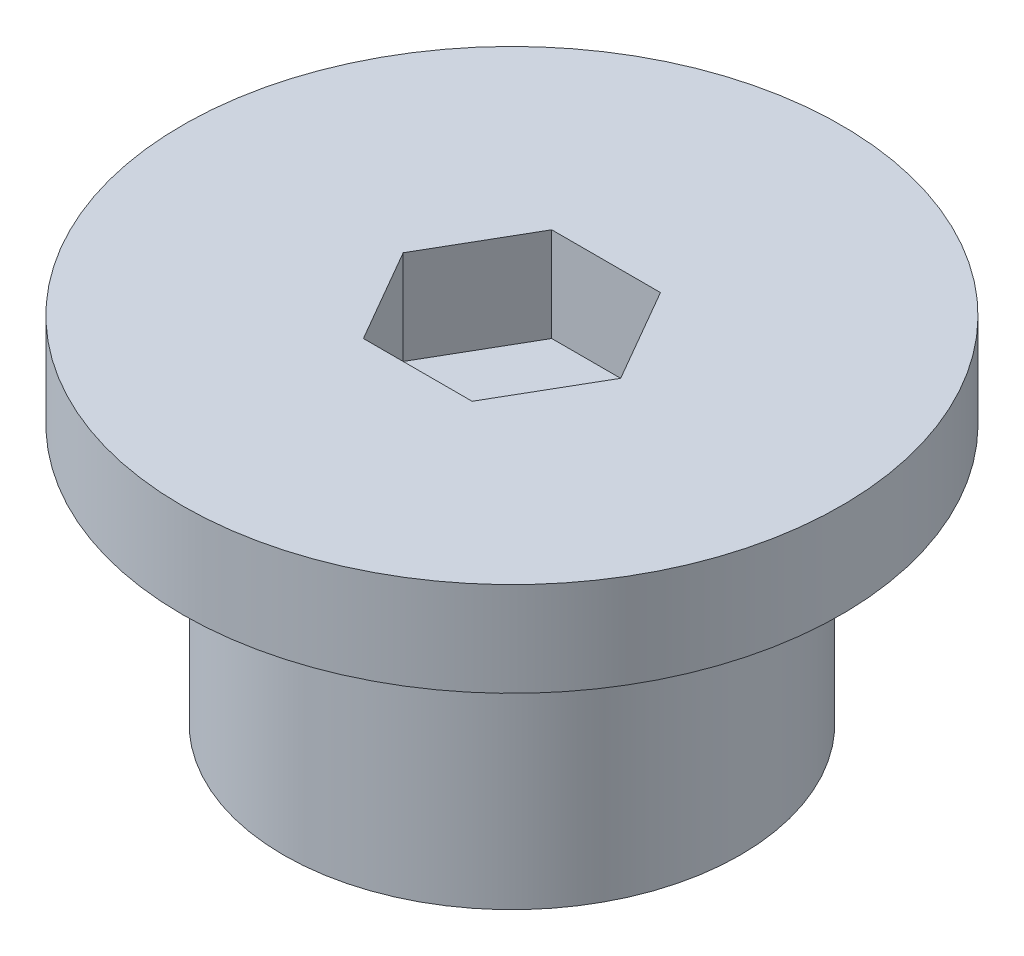
ISO-10303-21;
HEADER;
FILE_DESCRIPTION(('STEP AP214'),'2;1');
FILE_NAME('part.step','',(''),(''),'','','');
FILE_SCHEMA(('AUTOMOTIVE_DESIGN { 1 0 10303 214 1 1 1 1 }'));
ENDSEC;
DATA;
#1=APPLICATION_CONTEXT('core data for automotive mechanical design processes');
#2=APPLICATION_PROTOCOL_DEFINITION('international standard','automotive_design',2000,#1);
#3=PRODUCT_CONTEXT('',#1,'mechanical');
#4=PRODUCT('Part','Part','',(#3));
#5=PRODUCT_RELATED_PRODUCT_CATEGORY('part','',(#4));
#6=PRODUCT_DEFINITION_FORMATION('','',#4);
#7=PRODUCT_DEFINITION_CONTEXT('part definition',#1,'design');
#8=PRODUCT_DEFINITION('design','',#6,#7);
#9=PRODUCT_DEFINITION_SHAPE('','',#8);
#10=(LENGTH_UNIT() NAMED_UNIT(*) SI_UNIT(.MILLI.,.METRE.));
#11=(NAMED_UNIT(*) PLANE_ANGLE_UNIT() SI_UNIT($,.RADIAN.));
#12=(NAMED_UNIT(*) SI_UNIT($,.STERADIAN.) SOLID_ANGLE_UNIT());
#13=UNCERTAINTY_MEASURE_WITH_UNIT(LENGTH_MEASURE(1.E-05),#10,'distance_accuracy_value','');
#14=(GEOMETRIC_REPRESENTATION_CONTEXT(3) GLOBAL_UNCERTAINTY_ASSIGNED_CONTEXT((#13)) GLOBAL_UNIT_ASSIGNED_CONTEXT((#10,
#11,#12)) REPRESENTATION_CONTEXT('',''));
#15=CARTESIAN_POINT('',(0.,0.,0.));
#16=DIRECTION('',(0.,0.,1.));
#17=DIRECTION('',(1.,0.,0.));
#18=AXIS2_PLACEMENT_3D('',#15,#16,#17);
#19=CARTESIAN_POINT('',(0.,0.,0.));
#20=DIRECTION('',(0.,1.,0.));
#21=DIRECTION('',(0.,0.,1.));
#22=AXIS2_PLACEMENT_3D('',#19,#20,#21);
#23=PLANE('',#22);
#24=CARTESIAN_POINT('',(0.,0.,0.));
#25=DIRECTION('',(0.,1.,0.));
#26=DIRECTION('',(0.,0.,1.));
#27=AXIS2_PLACEMENT_3D('',#24,#25,#26);
#28=CIRCLE('',#27,4.85);
#29=CARTESIAN_POINT('',(0.,0.,4.85));
#30=VERTEX_POINT('',#29);
#31=EDGE_CURVE('E11',#30,#30,#28,.T.);
#32=ORIENTED_EDGE('',*,*,#31,.F.);
#33=EDGE_LOOP('',(#32));
#34=FACE_BOUND('',#33,.T.);
#35=ADVANCED_FACE('F38',(#34),#23,.F.);
#36=CARTESIAN_POINT('',(0.,21.439331354887,0.));
#37=DIRECTION('',(0.,1.,0.));
#38=DIRECTION('',(0.,0.,1.));
#39=AXIS2_PLACEMENT_3D('',#36,#37,#38);
#40=CYLINDRICAL_SURFACE('',#39,4.85);
#41=CARTESIAN_POINT('',(0.,5.5,0.));
#42=DIRECTION('',(0.,1.,0.));
#43=DIRECTION('',(0.,0.,1.));
#44=AXIS2_PLACEMENT_3D('',#41,#42,#43);
#45=CIRCLE('',#44,4.85);
#46=CARTESIAN_POINT('',(0.,5.5,4.85));
#47=VERTEX_POINT('',#46);
#48=EDGE_CURVE('E45',#47,#47,#45,.T.);
#49=ORIENTED_EDGE('',*,*,#48,.F.);
#50=EDGE_LOOP('',(#49));
#51=FACE_BOUND('',#50,.T.);
#52=ORIENTED_EDGE('',*,*,#31,.T.);
#53=EDGE_LOOP('',(#52));
#54=FACE_BOUND('',#53,.T.);
#55=ADVANCED_FACE('F154',(#51,#54),#40,.T.);
#56=CARTESIAN_POINT('',(4.85,5.5,0.));
#57=DIRECTION('',(0.,1.,0.));
#58=DIRECTION('',(0.,0.,1.));
#59=AXIS2_PLACEMENT_3D('',#56,#57,#58);
#60=PLANE('',#59);
#61=CARTESIAN_POINT('',(0.,5.5,0.));
#62=DIRECTION('',(0.,1.,0.));
#63=DIRECTION('',(0.,0.,1.));
#64=AXIS2_PLACEMENT_3D('',#61,#62,#63);
#65=CIRCLE('',#64,7.);
#66=CARTESIAN_POINT('',(0.,5.5,7.));
#67=VERTEX_POINT('',#66);
#68=EDGE_CURVE('E147',#67,#67,#65,.T.);
#69=ORIENTED_EDGE('',*,*,#68,.F.);
#70=EDGE_LOOP('',(#69));
#71=FACE_BOUND('',#70,.T.);
#72=ORIENTED_EDGE('',*,*,#48,.T.);
#73=EDGE_LOOP('',(#72));
#74=FACE_BOUND('',#73,.T.);
#75=ADVANCED_FACE('F152',(#71,#74),#60,.F.);
#76=CARTESIAN_POINT('',(0.,21.439331354887,0.));
#77=DIRECTION('',(0.,1.,0.));
#78=DIRECTION('',(0.,0.,1.));
#79=AXIS2_PLACEMENT_3D('',#76,#77,#78);
#80=CYLINDRICAL_SURFACE('',#79,7.);
#81=CARTESIAN_POINT('',(0.,7.5,0.));
#82=DIRECTION('',(0.,1.,0.));
#83=DIRECTION('',(0.,0.,1.));
#84=AXIS2_PLACEMENT_3D('',#81,#82,#83);
#85=CIRCLE('',#84,7.);
#86=CARTESIAN_POINT('',(0.,7.5,7.));
#87=VERTEX_POINT('',#86);
#88=EDGE_CURVE('E139',#87,#87,#85,.T.);
#89=ORIENTED_EDGE('',*,*,#88,.F.);
#90=EDGE_LOOP('',(#89));
#91=FACE_BOUND('',#90,.T.);
#92=ORIENTED_EDGE('',*,*,#68,.T.);
#93=EDGE_LOOP('',(#92));
#94=FACE_BOUND('',#93,.T.);
#95=ADVANCED_FACE('F173',(#91,#94),#80,.T.);
#96=CARTESIAN_POINT('',(0.,7.5,0.));
#97=DIRECTION('',(0.,-1.,0.));
#98=DIRECTION('',(0.,0.,-1.));
#99=AXIS2_PLACEMENT_3D('',#96,#97,#98);
#100=PLANE('',#99);
#101=DIRECTION('',(-0.5,0.,-0.866025403784438));
#102=VECTOR('',#101,1.);
#103=CARTESIAN_POINT('',(2.3094010767585,7.5,0.));
#104=LINE('',#103,#102);
#105=CARTESIAN_POINT('',(2.3094010767585,7.5,0.));
#106=VERTEX_POINT('',#105);
#107=CARTESIAN_POINT('',(1.15470053837925,7.5,-2.));
#108=VERTEX_POINT('',#107);
#109=EDGE_CURVE('E126',#106,#108,#104,.T.);
#110=ORIENTED_EDGE('',*,*,#109,.F.);
#111=DIRECTION('',(0.5,0.,-0.866025403784438));
#112=VECTOR('',#111,1.);
#113=CARTESIAN_POINT('',(1.15470053837925,7.5,2.));
#114=LINE('',#113,#112);
#115=CARTESIAN_POINT('',(1.15470053837925,7.5,2.));
#116=VERTEX_POINT('',#115);
#117=EDGE_CURVE('E52',#116,#106,#114,.T.);
#118=ORIENTED_EDGE('',*,*,#117,.F.);
#119=DIRECTION('',(1.,0.,0.));
#120=VECTOR('',#119,1.);
#121=CARTESIAN_POINT('',(-1.15470053837925,7.5,2.));
#122=LINE('',#121,#120);
#123=CARTESIAN_POINT('',(-1.15470053837925,7.5,2.));
#124=VERTEX_POINT('',#123);
#125=EDGE_CURVE('E135',#124,#116,#122,.T.);
#126=ORIENTED_EDGE('',*,*,#125,.F.);
#127=DIRECTION('',(0.5,0.,0.866025403784439));
#128=VECTOR('',#127,1.);
#129=CARTESIAN_POINT('',(-2.3094010767585,7.5,0.));
#130=LINE('',#129,#128);
#131=CARTESIAN_POINT('',(-2.3094010767585,7.5,0.));
#132=VERTEX_POINT('',#131);
#133=EDGE_CURVE('E133',#132,#124,#130,.T.);
#134=ORIENTED_EDGE('',*,*,#133,.F.);
#135=DIRECTION('',(-0.5,0.,0.866025403784439));
#136=VECTOR('',#135,1.);
#137=CARTESIAN_POINT('',(-1.15470053837925,7.5,-2.));
#138=LINE('',#137,#136);
#139=CARTESIAN_POINT('',(-1.15470053837925,7.5,-2.));
#140=VERTEX_POINT('',#139);
#141=EDGE_CURVE('E100',#140,#132,#138,.T.);
#142=ORIENTED_EDGE('',*,*,#141,.F.);
#143=DIRECTION('',(-1.,0.,0.));
#144=VECTOR('',#143,1.);
#145=CARTESIAN_POINT('',(1.15470053837925,7.5,-2.));
#146=LINE('',#145,#144);
#147=EDGE_CURVE('E129',#108,#140,#146,.T.);
#148=ORIENTED_EDGE('',*,*,#147,.F.);
#149=EDGE_LOOP('',(#110,#118,#126,#134,#142,#148));
#150=FACE_BOUND('',#149,.T.);
#151=ORIENTED_EDGE('',*,*,#88,.T.);
#152=EDGE_LOOP('',(#151));
#153=FACE_BOUND('',#152,.T.);
#154=ADVANCED_FACE('F181',(#150,#153),#100,.F.);
#155=CARTESIAN_POINT('',(1.15470053837925,5.5,2.));
#156=DIRECTION('',(0.866025403784439,0.,0.5));
#157=DIRECTION('',(0.5,0.,-0.866025403784439));
#158=AXIS2_PLACEMENT_3D('',#155,#156,#157);
#159=PLANE('',#158);
#160=ORIENTED_EDGE('',*,*,#117,.T.);
#161=DIRECTION('',(0.,1.,0.));
#162=VECTOR('',#161,1.);
#163=CARTESIAN_POINT('',(2.3094010767585,5.5,0.));
#164=LINE('',#163,#162);
#165=CARTESIAN_POINT('',(2.3094010767585,5.5,0.));
#166=VERTEX_POINT('',#165);
#167=EDGE_CURVE('E82',#166,#106,#164,.T.);
#168=ORIENTED_EDGE('',*,*,#167,.F.);
#169=DIRECTION('',(0.5,0.,-0.866025403784438));
#170=VECTOR('',#169,1.);
#171=CARTESIAN_POINT('',(1.15470053837925,5.5,2.));
#172=LINE('',#171,#170);
#173=CARTESIAN_POINT('',(1.15470053837925,5.5,2.));
#174=VERTEX_POINT('',#173);
#175=EDGE_CURVE('E137',#174,#166,#172,.T.);
#176=ORIENTED_EDGE('',*,*,#175,.F.);
#177=DIRECTION('',(0.,1.,0.));
#178=VECTOR('',#177,1.);
#179=CARTESIAN_POINT('',(1.15470053837925,5.5,2.));
#180=LINE('',#179,#178);
#181=EDGE_CURVE('E60',#174,#116,#180,.T.);
#182=ORIENTED_EDGE('',*,*,#181,.T.);
#183=EDGE_LOOP('',(#160,#168,#176,#182));
#184=FACE_BOUND('',#183,.T.);
#185=ADVANCED_FACE('F189',(#184),#159,.F.);
#186=CARTESIAN_POINT('',(-1.15470053837925,5.5,2.));
#187=DIRECTION('',(0.,0.,1.));
#188=DIRECTION('',(1.,0.,0.));
#189=AXIS2_PLACEMENT_3D('',#186,#187,#188);
#190=PLANE('',#189);
#191=ORIENTED_EDGE('',*,*,#125,.T.);
#192=ORIENTED_EDGE('',*,*,#181,.F.);
#193=DIRECTION('',(1.,0.,0.));
#194=VECTOR('',#193,1.);
#195=CARTESIAN_POINT('',(-1.15470053837925,5.5,2.));
#196=LINE('',#195,#194);
#197=CARTESIAN_POINT('',(-1.15470053837925,5.5,2.));
#198=VERTEX_POINT('',#197);
#199=EDGE_CURVE('E112',#198,#174,#196,.T.);
#200=ORIENTED_EDGE('',*,*,#199,.F.);
#201=DIRECTION('',(0.,1.,0.));
#202=VECTOR('',#201,1.);
#203=CARTESIAN_POINT('',(-1.15470053837925,5.5,2.));
#204=LINE('',#203,#202);
#205=EDGE_CURVE('E104',#198,#124,#204,.T.);
#206=ORIENTED_EDGE('',*,*,#205,.T.);
#207=EDGE_LOOP('',(#191,#192,#200,#206));
#208=FACE_BOUND('',#207,.T.);
#209=ADVANCED_FACE('F197',(#208),#190,.F.);
#210=CARTESIAN_POINT('',(-2.3094010767585,5.5,0.));
#211=DIRECTION('',(-0.866025403784438,0.,0.5));
#212=DIRECTION('',(0.5,0.,0.866025403784439));
#213=AXIS2_PLACEMENT_3D('',#210,#211,#212);
#214=PLANE('',#213);
#215=ORIENTED_EDGE('',*,*,#133,.T.);
#216=ORIENTED_EDGE('',*,*,#205,.F.);
#217=DIRECTION('',(0.5,0.,0.866025403784439));
#218=VECTOR('',#217,1.);
#219=CARTESIAN_POINT('',(-2.3094010767585,5.5,0.));
#220=LINE('',#219,#218);
#221=CARTESIAN_POINT('',(-2.3094010767585,5.5,0.));
#222=VERTEX_POINT('',#221);
#223=EDGE_CURVE('E108',#222,#198,#220,.T.);
#224=ORIENTED_EDGE('',*,*,#223,.F.);
#225=DIRECTION('',(0.,1.,0.));
#226=VECTOR('',#225,1.);
#227=CARTESIAN_POINT('',(-2.3094010767585,5.5,0.));
#228=LINE('',#227,#226);
#229=EDGE_CURVE('E93',#222,#132,#228,.T.);
#230=ORIENTED_EDGE('',*,*,#229,.T.);
#231=EDGE_LOOP('',(#215,#216,#224,#230));
#232=FACE_BOUND('',#231,.T.);
#233=ADVANCED_FACE('F109',(#232),#214,.F.);
#234=CARTESIAN_POINT('',(-1.15470053837925,5.5,-2.));
#235=DIRECTION('',(-0.866025403784439,0.,-0.5));
#236=DIRECTION('',(-0.5,0.,0.866025403784439));
#237=AXIS2_PLACEMENT_3D('',#234,#235,#236);
#238=PLANE('',#237);
#239=ORIENTED_EDGE('',*,*,#141,.T.);
#240=ORIENTED_EDGE('',*,*,#229,.F.);
#241=DIRECTION('',(-0.5,0.,0.866025403784439));
#242=VECTOR('',#241,1.);
#243=CARTESIAN_POINT('',(-1.15470053837925,5.5,-2.));
#244=LINE('',#243,#242);
#245=CARTESIAN_POINT('',(-1.15470053837925,5.5,-2.));
#246=VERTEX_POINT('',#245);
#247=EDGE_CURVE('E97',#246,#222,#244,.T.);
#248=ORIENTED_EDGE('',*,*,#247,.F.);
#249=DIRECTION('',(0.,1.,0.));
#250=VECTOR('',#249,1.);
#251=CARTESIAN_POINT('',(-1.15470053837925,5.5,-2.));
#252=LINE('',#251,#250);
#253=EDGE_CURVE('E105',#246,#140,#252,.T.);
#254=ORIENTED_EDGE('',*,*,#253,.T.);
#255=EDGE_LOOP('',(#239,#240,#248,#254));
#256=FACE_BOUND('',#255,.T.);
#257=ADVANCED_FACE('F95',(#256),#238,.F.);
#258=CARTESIAN_POINT('',(1.15470053837925,5.5,-2.));
#259=DIRECTION('',(0.,0.,-1.));
#260=DIRECTION('',(-1.,0.,0.));
#261=AXIS2_PLACEMENT_3D('',#258,#259,#260);
#262=PLANE('',#261);
#263=ORIENTED_EDGE('',*,*,#147,.T.);
#264=ORIENTED_EDGE('',*,*,#253,.F.);
#265=DIRECTION('',(-1.,0.,0.));
#266=VECTOR('',#265,1.);
#267=CARTESIAN_POINT('',(1.15470053837925,5.5,-2.));
#268=LINE('',#267,#266);
#269=CARTESIAN_POINT('',(1.15470053837925,5.5,-2.));
#270=VERTEX_POINT('',#269);
#271=EDGE_CURVE('E118',#270,#246,#268,.T.);
#272=ORIENTED_EDGE('',*,*,#271,.F.);
#273=DIRECTION('',(0.,1.,0.));
#274=VECTOR('',#273,1.);
#275=CARTESIAN_POINT('',(1.15470053837925,5.5,-2.));
#276=LINE('',#275,#274);
#277=EDGE_CURVE('E142',#270,#108,#276,.T.);
#278=ORIENTED_EDGE('',*,*,#277,.T.);
#279=EDGE_LOOP('',(#263,#264,#272,#278));
#280=FACE_BOUND('',#279,.T.);
#281=ADVANCED_FACE('F216',(#280),#262,.F.);
#282=CARTESIAN_POINT('',(2.3094010767585,5.5,0.));
#283=DIRECTION('',(0.866025403784438,0.,-0.5));
#284=DIRECTION('',(-0.5,0.,-0.866025403784438));
#285=AXIS2_PLACEMENT_3D('',#282,#283,#284);
#286=PLANE('',#285);
#287=ORIENTED_EDGE('',*,*,#109,.T.);
#288=ORIENTED_EDGE('',*,*,#277,.F.);
#289=DIRECTION('',(-0.5,0.,-0.866025403784438));
#290=VECTOR('',#289,1.);
#291=CARTESIAN_POINT('',(2.3094010767585,5.5,0.));
#292=LINE('',#291,#290);
#293=EDGE_CURVE('E120',#166,#270,#292,.T.);
#294=ORIENTED_EDGE('',*,*,#293,.F.);
#295=ORIENTED_EDGE('',*,*,#167,.T.);
#296=EDGE_LOOP('',(#287,#288,#294,#295));
#297=FACE_BOUND('',#296,.T.);
#298=ADVANCED_FACE('F223',(#297),#286,.F.);
#299=CARTESIAN_POINT('',(0.,5.5,0.));
#300=DIRECTION('',(0.,1.,0.));
#301=DIRECTION('',(0.,0.,1.));
#302=AXIS2_PLACEMENT_3D('',#299,#300,#301);
#303=PLANE('',#302);
#304=ORIENTED_EDGE('',*,*,#175,.T.);
#305=ORIENTED_EDGE('',*,*,#293,.T.);
#306=ORIENTED_EDGE('',*,*,#271,.T.);
#307=ORIENTED_EDGE('',*,*,#247,.T.);
#308=ORIENTED_EDGE('',*,*,#223,.T.);
#309=ORIENTED_EDGE('',*,*,#199,.T.);
#310=EDGE_LOOP('',(#304,#305,#306,#307,#308,#309));
#311=FACE_BOUND('',#310,.T.);
#312=ADVANCED_FACE('F115',(#311),#303,.T.);
#313=CLOSED_SHELL('',(#35,#55,#75,#95,#154,#185,#209,#233,#257,#281,#298,#312));
#314=MANIFOLD_SOLID_BREP('B2',#313);
#315=ADVANCED_BREP_SHAPE_REPRESENTATION('',(#18,#314),#14);
#316=SHAPE_DEFINITION_REPRESENTATION(#9,#315);
ENDSEC;
END-ISO-10303-21;
